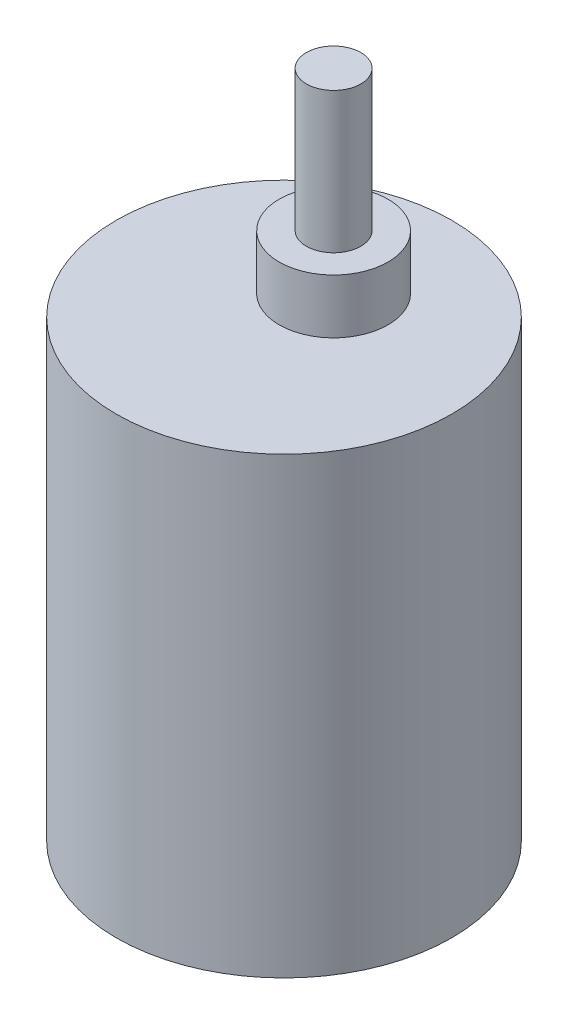
ISO-10303-21;
HEADER;
FILE_DESCRIPTION(('STEP AP214'),'2;1');
FILE_NAME('part.step','',(''),(''),'','','');
FILE_SCHEMA(('AUTOMOTIVE_DESIGN { 1 0 10303 214 1 1 1 1 }'));
ENDSEC;
DATA;
#1=APPLICATION_CONTEXT('core data for automotive mechanical design processes');
#2=APPLICATION_PROTOCOL_DEFINITION('international standard','automotive_design',2000,#1);
#3=PRODUCT_CONTEXT('',#1,'mechanical');
#4=PRODUCT('Part','Part','',(#3));
#5=PRODUCT_RELATED_PRODUCT_CATEGORY('part','',(#4));
#6=PRODUCT_DEFINITION_FORMATION('','',#4);
#7=PRODUCT_DEFINITION_CONTEXT('part definition',#1,'design');
#8=PRODUCT_DEFINITION('design','',#6,#7);
#9=PRODUCT_DEFINITION_SHAPE('','',#8);
#10=(LENGTH_UNIT() NAMED_UNIT(*) SI_UNIT(.MILLI.,.METRE.));
#11=(NAMED_UNIT(*) PLANE_ANGLE_UNIT() SI_UNIT($,.RADIAN.));
#12=(NAMED_UNIT(*) SI_UNIT($,.STERADIAN.) SOLID_ANGLE_UNIT());
#13=UNCERTAINTY_MEASURE_WITH_UNIT(LENGTH_MEASURE(1.E-05),#10,'distance_accuracy_value','');
#14=(GEOMETRIC_REPRESENTATION_CONTEXT(3) GLOBAL_UNCERTAINTY_ASSIGNED_CONTEXT((#13)) GLOBAL_UNIT_ASSIGNED_CONTEXT((#10,
#11,#12)) REPRESENTATION_CONTEXT('',''));
#15=CARTESIAN_POINT('',(0.,0.,0.));
#16=DIRECTION('',(0.,0.,1.));
#17=DIRECTION('',(1.,0.,0.));
#18=AXIS2_PLACEMENT_3D('',#15,#16,#17);
#19=CARTESIAN_POINT('',(0.467490015580357,56.,-5.));
#20=DIRECTION('',(0.,1.,0.));
#21=DIRECTION('',(0.,0.,1.));
#22=AXIS2_PLACEMENT_3D('',#19,#20,#21);
#23=PLANE('',#22);
#24=CARTESIAN_POINT('',(0.467490015580357,56.,-5.));
#25=DIRECTION('',(0.,1.,0.));
#26=DIRECTION('',(0.,0.,1.));
#27=AXIS2_PLACEMENT_3D('',#24,#25,#26);
#28=CIRCLE('',#27,6.);
#29=CARTESIAN_POINT('',(0.467490015580357,56.,1.));
#30=VERTEX_POINT('',#29);
#31=EDGE_CURVE('E42',#30,#30,#28,.T.);
#32=ORIENTED_EDGE('',*,*,#31,.T.);
#33=EDGE_LOOP('',(#32));
#34=FACE_BOUND('',#33,.T.);
#35=CARTESIAN_POINT('',(0.467490015580357,56.,-5.));
#36=DIRECTION('',(0.,1.,0.));
#37=DIRECTION('',(0.,0.,1.));
#38=AXIS2_PLACEMENT_3D('',#35,#36,#37);
#39=CIRCLE('',#38,3.);
#40=CARTESIAN_POINT('',(0.467490015580357,56.,-2.));
#41=VERTEX_POINT('',#40);
#42=EDGE_CURVE('E50',#41,#41,#39,.T.);
#43=ORIENTED_EDGE('',*,*,#42,.F.);
#44=EDGE_LOOP('',(#43));
#45=FACE_BOUND('',#44,.T.);
#46=ADVANCED_FACE('F31',(#34,#45),#23,.T.);
#47=CARTESIAN_POINT('',(0.,50.,0.));
#48=DIRECTION('',(0.,1.,0.));
#49=DIRECTION('',(0.,0.,1.));
#50=AXIS2_PLACEMENT_3D('',#47,#48,#49);
#51=PLANE('',#50);
#52=CARTESIAN_POINT('',(0.,50.,0.));
#53=DIRECTION('',(0.,1.,0.));
#54=DIRECTION('',(0.,0.,1.));
#55=AXIS2_PLACEMENT_3D('',#52,#53,#54);
#56=CIRCLE('',#55,18.5);
#57=CARTESIAN_POINT('',(0.,50.,18.5));
#58=VERTEX_POINT('',#57);
#59=EDGE_CURVE('E10',#58,#58,#56,.T.);
#60=ORIENTED_EDGE('',*,*,#59,.T.);
#61=EDGE_LOOP('',(#60));
#62=FACE_BOUND('',#61,.T.);
#63=CARTESIAN_POINT('',(0.467490015580357,50.,-5.));
#64=DIRECTION('',(0.,1.,0.));
#65=DIRECTION('',(0.,0.,1.));
#66=AXIS2_PLACEMENT_3D('',#63,#64,#65);
#67=CIRCLE('',#66,6.);
#68=CARTESIAN_POINT('',(0.467490015580357,50.,1.));
#69=VERTEX_POINT('',#68);
#70=EDGE_CURVE('E44',#69,#69,#67,.T.);
#71=ORIENTED_EDGE('',*,*,#70,.F.);
#72=EDGE_LOOP('',(#71));
#73=FACE_BOUND('',#72,.T.);
#74=ADVANCED_FACE('F66',(#62,#73),#51,.T.);
#75=CARTESIAN_POINT('',(0.,50.,0.));
#76=DIRECTION('',(0.,-1.,0.));
#77=DIRECTION('',(0.,0.,-1.));
#78=AXIS2_PLACEMENT_3D('',#75,#76,#77);
#79=CYLINDRICAL_SURFACE('',#78,18.5);
#80=ORIENTED_EDGE('',*,*,#59,.F.);
#81=EDGE_LOOP('',(#80));
#82=FACE_BOUND('',#81,.T.);
#83=CARTESIAN_POINT('',(0.,0.,0.));
#84=DIRECTION('',(0.,1.,0.));
#85=DIRECTION('',(0.,0.,1.));
#86=AXIS2_PLACEMENT_3D('',#83,#84,#85);
#87=CIRCLE('',#86,18.5);
#88=CARTESIAN_POINT('',(0.,0.,18.5));
#89=VERTEX_POINT('',#88);
#90=EDGE_CURVE('E35',#89,#89,#87,.T.);
#91=ORIENTED_EDGE('',*,*,#90,.T.);
#92=EDGE_LOOP('',(#91));
#93=FACE_BOUND('',#92,.T.);
#94=ADVANCED_FACE('F33',(#82,#93),#79,.T.);
#95=CARTESIAN_POINT('',(0.,0.,0.));
#96=DIRECTION('',(0.,1.,0.));
#97=DIRECTION('',(0.,0.,1.));
#98=AXIS2_PLACEMENT_3D('',#95,#96,#97);
#99=PLANE('',#98);
#100=ORIENTED_EDGE('',*,*,#90,.F.);
#101=EDGE_LOOP('',(#100));
#102=FACE_BOUND('',#101,.T.);
#103=ADVANCED_FACE('F76',(#102),#99,.F.);
#104=CARTESIAN_POINT('',(0.467490015580357,56.,-5.));
#105=DIRECTION('',(0.,-1.,0.));
#106=DIRECTION('',(0.,0.,-1.));
#107=AXIS2_PLACEMENT_3D('',#104,#105,#106);
#108=CYLINDRICAL_SURFACE('',#107,6.);
#109=ORIENTED_EDGE('',*,*,#31,.F.);
#110=EDGE_LOOP('',(#109));
#111=FACE_BOUND('',#110,.T.);
#112=ORIENTED_EDGE('',*,*,#70,.T.);
#113=EDGE_LOOP('',(#112));
#114=FACE_BOUND('',#113,.T.);
#115=ADVANCED_FACE('F61',(#111,#114),#108,.T.);
#116=CARTESIAN_POINT('',(0.467490015580357,71.5,-5.));
#117=DIRECTION('',(0.,-1.,0.));
#118=DIRECTION('',(0.,0.,-1.));
#119=AXIS2_PLACEMENT_3D('',#116,#117,#118);
#120=CYLINDRICAL_SURFACE('',#119,3.);
#121=CARTESIAN_POINT('',(0.467490015580357,71.5,-5.));
#122=DIRECTION('',(0.,1.,0.));
#123=DIRECTION('',(0.,0.,1.));
#124=AXIS2_PLACEMENT_3D('',#121,#122,#123);
#125=CIRCLE('',#124,3.);
#126=CARTESIAN_POINT('',(0.467490015580357,71.5,-2.));
#127=VERTEX_POINT('',#126);
#128=EDGE_CURVE('E47',#127,#127,#125,.T.);
#129=ORIENTED_EDGE('',*,*,#128,.F.);
#130=EDGE_LOOP('',(#129));
#131=FACE_BOUND('',#130,.T.);
#132=ORIENTED_EDGE('',*,*,#42,.T.);
#133=EDGE_LOOP('',(#132));
#134=FACE_BOUND('',#133,.T.);
#135=ADVANCED_FACE('F58',(#131,#134),#120,.T.);
#136=CARTESIAN_POINT('',(0.467490015580357,71.5,-5.));
#137=DIRECTION('',(0.,1.,0.));
#138=DIRECTION('',(0.,0.,1.));
#139=AXIS2_PLACEMENT_3D('',#136,#137,#138);
#140=PLANE('',#139);
#141=ORIENTED_EDGE('',*,*,#128,.T.);
#142=EDGE_LOOP('',(#141));
#143=FACE_BOUND('',#142,.T.);
#144=ADVANCED_FACE('F56',(#143),#140,.T.);
#145=CLOSED_SHELL('',(#46,#74,#94,#103,#115,#135,#144));
#146=MANIFOLD_SOLID_BREP('B2',#145);
#147=ADVANCED_BREP_SHAPE_REPRESENTATION('',(#18,#146),#14);
#148=SHAPE_DEFINITION_REPRESENTATION(#9,#147);
ENDSEC;
END-ISO-10303-21;
